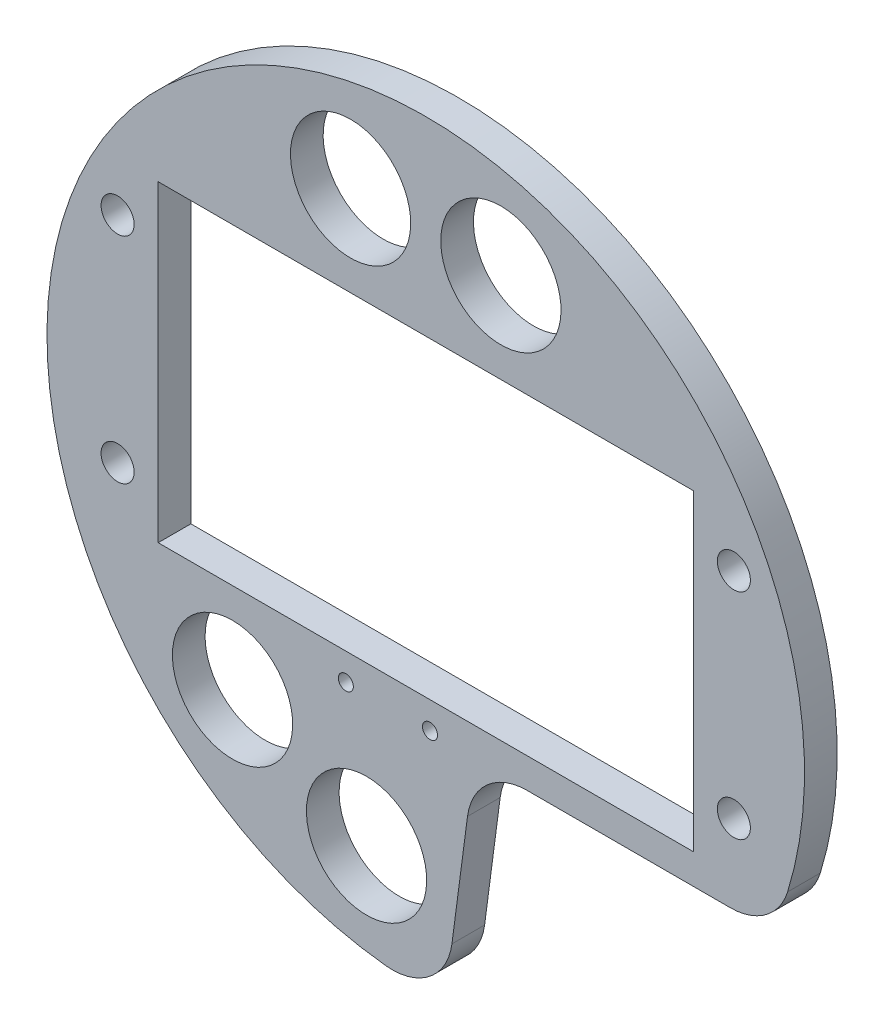
ISO-10303-21;
HEADER;
FILE_DESCRIPTION(('STEP AP214'),'2;1');
FILE_NAME('part.step','',(''),(''),'','','');
FILE_SCHEMA(('AUTOMOTIVE_DESIGN { 1 0 10303 214 1 1 1 1 }'));
ENDSEC;
DATA;
#1=APPLICATION_CONTEXT('core data for automotive mechanical design processes');
#2=APPLICATION_PROTOCOL_DEFINITION('international standard','automotive_design',2000,#1);
#3=PRODUCT_CONTEXT('',#1,'mechanical');
#4=PRODUCT('Part','Part','',(#3));
#5=PRODUCT_RELATED_PRODUCT_CATEGORY('part','',(#4));
#6=PRODUCT_DEFINITION_FORMATION('','',#4);
#7=PRODUCT_DEFINITION_CONTEXT('part definition',#1,'design');
#8=PRODUCT_DEFINITION('design','',#6,#7);
#9=PRODUCT_DEFINITION_SHAPE('','',#8);
#10=(LENGTH_UNIT() NAMED_UNIT(*) SI_UNIT(.MILLI.,.METRE.));
#11=(NAMED_UNIT(*) PLANE_ANGLE_UNIT() SI_UNIT($,.RADIAN.));
#12=(NAMED_UNIT(*) SI_UNIT($,.STERADIAN.) SOLID_ANGLE_UNIT());
#13=UNCERTAINTY_MEASURE_WITH_UNIT(LENGTH_MEASURE(1.E-05),#10,'distance_accuracy_value','');
#14=(GEOMETRIC_REPRESENTATION_CONTEXT(3) GLOBAL_UNCERTAINTY_ASSIGNED_CONTEXT((#13)) GLOBAL_UNIT_ASSIGNED_CONTEXT((#10,
#11,#12)) REPRESENTATION_CONTEXT('',''));
#15=CARTESIAN_POINT('',(0.,0.,0.));
#16=DIRECTION('',(0.,0.,1.));
#17=DIRECTION('',(1.,0.,0.));
#18=AXIS2_PLACEMENT_3D('',#15,#16,#17);
#19=CARTESIAN_POINT('',(50.6348115954456,-15.65617624753,-105.1894));
#20=DIRECTION('',(0.,0.,-1.));
#21=DIRECTION('',(0.,1.,0.));
#22=AXIS2_PLACEMENT_3D('',#19,#20,#21);
#23=CYLINDRICAL_SURFACE('',#22,10.);
#24=CARTESIAN_POINT('',(50.6348115954456,-15.65617624753,-110.625));
#25=DIRECTION('',(0.,0.,-1.));
#26=DIRECTION('',(0.,-1.,0.));
#27=AXIS2_PLACEMENT_3D('',#24,#25,#26);
#28=CIRCLE('',#27,10.);
#29=CARTESIAN_POINT('',(60.1885496323222,-18.6101717659319,-110.625));
#30=VERTEX_POINT('',#29);
#31=CARTESIAN_POINT('',(50.6348115954456,-25.65617624753,-110.625));
#32=VERTEX_POINT('',#31);
#33=EDGE_CURVE('E150',#30,#32,#28,.T.);
#34=ORIENTED_EDGE('',*,*,#33,.F.);
#35=DIRECTION('',(0.,0.,-1.));
#36=VECTOR('',#35,1.);
#37=CARTESIAN_POINT('',(60.1885496323222,-18.6101717659319,-105.1894));
#38=LINE('',#37,#36);
#39=CARTESIAN_POINT('',(60.1885496323222,-18.6101717659319,-105.1894));
#40=VERTEX_POINT('',#39);
#41=EDGE_CURVE('E11',#40,#30,#38,.T.);
#42=ORIENTED_EDGE('',*,*,#41,.F.);
#43=CARTESIAN_POINT('',(50.6348115954456,-15.65617624753,-105.1894));
#44=DIRECTION('',(0.,0.,-1.));
#45=DIRECTION('',(0.,-1.,0.));
#46=AXIS2_PLACEMENT_3D('',#43,#44,#45);
#47=CIRCLE('',#46,10.);
#48=CARTESIAN_POINT('',(50.6348115954456,-25.65617624753,-105.1894));
#49=VERTEX_POINT('',#48);
#50=EDGE_CURVE('E154',#40,#49,#47,.T.);
#51=ORIENTED_EDGE('',*,*,#50,.T.);
#52=DIRECTION('',(0.,0.,-1.));
#53=VECTOR('',#52,1.);
#54=CARTESIAN_POINT('',(50.6348115954456,-25.65617624753,-105.1894));
#55=LINE('',#54,#53);
#56=EDGE_CURVE('E39',#49,#32,#55,.T.);
#57=ORIENTED_EDGE('',*,*,#56,.T.);
#58=EDGE_LOOP('',(#34,#42,#51,#57));
#59=FACE_BOUND('',#58,.T.);
#60=ADVANCED_FACE('F36',(#59),#23,.T.);
#61=CARTESIAN_POINT('',(0.,0.,-105.1894));
#62=DIRECTION('',(0.,0.,-1.));
#63=DIRECTION('',(0.,1.,0.));
#64=AXIS2_PLACEMENT_3D('',#61,#62,#63);
#65=CYLINDRICAL_SURFACE('',#64,63.);
#66=CARTESIAN_POINT('',(0.,0.,-110.625));
#67=DIRECTION('',(0.,0.,-1.));
#68=DIRECTION('',(0.,1.,0.));
#69=AXIS2_PLACEMENT_3D('',#66,#67,#68);
#70=CIRCLE('',#69,63.);
#71=CARTESIAN_POINT('',(-6.60549085481736,-62.6527532560775,-110.625));
#72=VERTEX_POINT('',#71);
#73=EDGE_CURVE('E158',#72,#30,#70,.T.);
#74=ORIENTED_EDGE('',*,*,#73,.F.);
#75=DIRECTION('',(0.,0.,-1.));
#76=VECTOR('',#75,1.);
#77=CARTESIAN_POINT('',(-6.60549085481736,-62.6527532560775,-105.1894));
#78=LINE('',#77,#76);
#79=CARTESIAN_POINT('',(-6.60549085481736,-62.6527532560775,-105.1894));
#80=VERTEX_POINT('',#79);
#81=EDGE_CURVE('E44',#80,#72,#78,.T.);
#82=ORIENTED_EDGE('',*,*,#81,.F.);
#83=CARTESIAN_POINT('',(0.,0.,-105.1894));
#84=DIRECTION('',(0.,0.,-1.));
#85=DIRECTION('',(0.,1.,0.));
#86=AXIS2_PLACEMENT_3D('',#83,#84,#85);
#87=CIRCLE('',#86,63.);
#88=EDGE_CURVE('E170',#80,#40,#87,.T.);
#89=ORIENTED_EDGE('',*,*,#88,.T.);
#90=ORIENTED_EDGE('',*,*,#41,.T.);
#91=EDGE_LOOP('',(#74,#82,#89,#90));
#92=FACE_BOUND('',#91,.T.);
#93=ADVANCED_FACE('F207',(#92),#65,.T.);
#94=CARTESIAN_POINT('',(-5.55700024294159,-52.7078717868588,-105.1894));
#95=DIRECTION('',(0.,0.,-1.));
#96=DIRECTION('',(0.,1.,0.));
#97=AXIS2_PLACEMENT_3D('',#94,#95,#96);
#98=CYLINDRICAL_SURFACE('',#97,9.99999999999999);
#99=CARTESIAN_POINT('',(-5.55700024294159,-52.7078717868588,-110.625));
#100=DIRECTION('',(0.,0.,-1.));
#101=DIRECTION('',(0.,1.,0.));
#102=AXIS2_PLACEMENT_3D('',#99,#100,#101);
#103=CIRCLE('',#102,9.99999999999999);
#104=CARTESIAN_POINT('',(4.35744837079652,-54.0131337090593,-110.625));
#105=VERTEX_POINT('',#104);
#106=EDGE_CURVE('E184',#105,#72,#103,.T.);
#107=ORIENTED_EDGE('',*,*,#106,.F.);
#108=DIRECTION('',(0.,0.,-1.));
#109=VECTOR('',#108,1.);
#110=CARTESIAN_POINT('',(4.35744837079652,-54.0131337090593,-105.1894));
#111=LINE('',#110,#109);
#112=CARTESIAN_POINT('',(4.35744837079652,-54.0131337090593,-105.1894));
#113=VERTEX_POINT('',#112);
#114=EDGE_CURVE('E190',#113,#105,#111,.T.);
#115=ORIENTED_EDGE('',*,*,#114,.F.);
#116=CARTESIAN_POINT('',(-5.55700024294159,-52.7078717868588,-105.1894));
#117=DIRECTION('',(0.,0.,-1.));
#118=DIRECTION('',(0.,1.,0.));
#119=AXIS2_PLACEMENT_3D('',#116,#117,#118);
#120=CIRCLE('',#119,9.99999999999999);
#121=EDGE_CURVE('E167',#113,#80,#120,.T.);
#122=ORIENTED_EDGE('',*,*,#121,.T.);
#123=ORIENTED_EDGE('',*,*,#81,.T.);
#124=EDGE_LOOP('',(#107,#115,#122,#123));
#125=FACE_BOUND('',#124,.T.);
#126=ADVANCED_FACE('F218',(#125),#98,.T.);
#127=CARTESIAN_POINT('',(4.35744837079652,-54.0131337090593,-105.1894));
#128=DIRECTION('',(0.991444861373811,-0.130526192220045,0.));
#129=DIRECTION('',(0.130526192220045,0.991444861373811,0.));
#130=AXIS2_PLACEMENT_3D('',#127,#128,#129);
#131=PLANE('',#130);
#132=DIRECTION('',(-0.130526192220045,-0.991444861373811,0.));
#133=VECTOR('',#132,1.);
#134=CARTESIAN_POINT('',(4.35744837079652,-54.0131337090593,-110.625));
#135=LINE('',#134,#133);
#136=CARTESIAN_POINT('',(6.94602866077572,-34.3509143253296,-110.625));
#137=VERTEX_POINT('',#136);
#138=EDGE_CURVE('E181',#137,#105,#135,.T.);
#139=ORIENTED_EDGE('',*,*,#138,.F.);
#140=DIRECTION('',(0.,0.,-1.));
#141=VECTOR('',#140,1.);
#142=CARTESIAN_POINT('',(6.94602866077572,-34.3509143253296,-105.1894));
#143=LINE('',#142,#141);
#144=CARTESIAN_POINT('',(6.94602866077572,-34.3509143253296,-105.1894));
#145=VERTEX_POINT('',#144);
#146=EDGE_CURVE('E192',#145,#137,#143,.T.);
#147=ORIENTED_EDGE('',*,*,#146,.F.);
#148=DIRECTION('',(-0.130526192220045,-0.991444861373811,0.));
#149=VECTOR('',#148,1.);
#150=CARTESIAN_POINT('',(4.35744837079652,-54.0131337090593,-105.1894));
#151=LINE('',#150,#149);
#152=EDGE_CURVE('E164',#145,#113,#151,.T.);
#153=ORIENTED_EDGE('',*,*,#152,.T.);
#154=ORIENTED_EDGE('',*,*,#114,.T.);
#155=EDGE_LOOP('',(#139,#147,#153,#154));
#156=FACE_BOUND('',#155,.T.);
#157=ADVANCED_FACE('F216',(#156),#131,.T.);
#158=CARTESIAN_POINT('',(16.8604772745138,-35.65617624753,-105.1894));
#159=DIRECTION('',(0.,0.,-1.));
#160=DIRECTION('',(0.,1.,0.));
#161=AXIS2_PLACEMENT_3D('',#158,#159,#160);
#162=CYLINDRICAL_SURFACE('',#161,10.);
#163=CARTESIAN_POINT('',(16.8604772745138,-35.65617624753,-110.625));
#164=DIRECTION('',(0.,0.,1.));
#165=DIRECTION('',(0.,1.,0.));
#166=AXIS2_PLACEMENT_3D('',#163,#164,#165);
#167=CIRCLE('',#166,10.);
#168=CARTESIAN_POINT('',(16.8604772745138,-25.65617624753,-110.625));
#169=VERTEX_POINT('',#168);
#170=EDGE_CURVE('E178',#169,#137,#167,.T.);
#171=ORIENTED_EDGE('',*,*,#170,.F.);
#172=DIRECTION('',(0.,0.,-1.));
#173=VECTOR('',#172,1.);
#174=CARTESIAN_POINT('',(16.8604772745138,-25.65617624753,-105.1894));
#175=LINE('',#174,#173);
#176=CARTESIAN_POINT('',(16.8604772745138,-25.65617624753,-105.1894));
#177=VERTEX_POINT('',#176);
#178=EDGE_CURVE('E193',#177,#169,#175,.T.);
#179=ORIENTED_EDGE('',*,*,#178,.F.);
#180=CARTESIAN_POINT('',(16.8604772745138,-35.65617624753,-105.1894));
#181=DIRECTION('',(0.,0.,1.));
#182=DIRECTION('',(0.,1.,0.));
#183=AXIS2_PLACEMENT_3D('',#180,#181,#182);
#184=CIRCLE('',#183,10.);
#185=EDGE_CURVE('E161',#177,#145,#184,.T.);
#186=ORIENTED_EDGE('',*,*,#185,.T.);
#187=ORIENTED_EDGE('',*,*,#146,.T.);
#188=EDGE_LOOP('',(#171,#179,#186,#187));
#189=FACE_BOUND('',#188,.T.);
#190=ADVANCED_FACE('F213',(#189),#162,.F.);
#191=CARTESIAN_POINT('',(16.8604772745138,-25.65617624753,-105.1894));
#192=DIRECTION('',(0.,-1.,0.));
#193=DIRECTION('',(0.,0.,-1.));
#194=AXIS2_PLACEMENT_3D('',#191,#192,#193);
#195=PLANE('',#194);
#196=DIRECTION('',(-1.,0.,0.));
#197=VECTOR('',#196,1.);
#198=CARTESIAN_POINT('',(16.8604772745138,-25.65617624753,-110.625));
#199=LINE('',#198,#197);
#200=EDGE_CURVE('E175',#32,#169,#199,.T.);
#201=ORIENTED_EDGE('',*,*,#200,.F.);
#202=ORIENTED_EDGE('',*,*,#56,.F.);
#203=DIRECTION('',(-1.,0.,0.));
#204=VECTOR('',#203,1.);
#205=CARTESIAN_POINT('',(16.8604772745138,-25.65617624753,-105.1894));
#206=LINE('',#205,#204);
#207=EDGE_CURVE('E157',#49,#177,#206,.T.);
#208=ORIENTED_EDGE('',*,*,#207,.T.);
#209=ORIENTED_EDGE('',*,*,#178,.T.);
#210=EDGE_LOOP('',(#201,#202,#208,#209));
#211=FACE_BOUND('',#210,.T.);
#212=ADVANCED_FACE('F201',(#211),#195,.T.);
#213=CARTESIAN_POINT('',(50.6348115954456,-15.65617624753,-105.1894));
#214=DIRECTION('',(0.,0.,1.));
#215=DIRECTION('',(0.,-1.,0.));
#216=AXIS2_PLACEMENT_3D('',#213,#214,#215);
#217=PLANE('',#216);
#218=CARTESIAN_POINT('',(0.708583228807126,-25.15617624753,-105.1894));
#219=DIRECTION('',(0.,0.,-1.));
#220=DIRECTION('',(0.,1.,0.));
#221=AXIS2_PLACEMENT_3D('',#218,#219,#220);
#222=CIRCLE('',#221,1.25);
#223=CARTESIAN_POINT('',(0.708583228807126,-23.90617624753,-105.1894));
#224=VERTEX_POINT('',#223);
#225=EDGE_CURVE('E419',#224,#224,#222,.T.);
#226=ORIENTED_EDGE('',*,*,#225,.T.);
#227=EDGE_LOOP('',(#226));
#228=FACE_BOUND('',#227,.T.);
#229=CARTESIAN_POINT('',(-13.2914167711929,-25.15617624753,-105.1894));
#230=DIRECTION('',(0.,0.,-1.));
#231=DIRECTION('',(0.,1.,0.));
#232=AXIS2_PLACEMENT_3D('',#229,#230,#231);
#233=CIRCLE('',#232,1.25);
#234=CARTESIAN_POINT('',(-13.2914167711929,-23.90617624753,-105.1894));
#235=VERTEX_POINT('',#234);
#236=EDGE_CURVE('E427',#235,#235,#233,.T.);
#237=ORIENTED_EDGE('',*,*,#236,.T.);
#238=EDGE_LOOP('',(#237));
#239=FACE_BOUND('',#238,.T.);
#240=CARTESIAN_POINT('',(51.25,23.1840462387393,-105.1894));
#241=DIRECTION('',(0.,0.,-1.));
#242=DIRECTION('',(0.,1.,0.));
#243=AXIS2_PLACEMENT_3D('',#240,#241,#242);
#244=CIRCLE('',#243,2.75);
#245=CARTESIAN_POINT('',(51.25,25.9340462387393,-105.1894));
#246=VERTEX_POINT('',#245);
#247=EDGE_CURVE('E433',#246,#246,#244,.T.);
#248=ORIENTED_EDGE('',*,*,#247,.T.);
#249=EDGE_LOOP('',(#248));
#250=FACE_BOUND('',#249,.T.);
#251=CARTESIAN_POINT('',(51.25,-12.4963987337993,-105.1894));
#252=DIRECTION('',(0.,0.,-1.));
#253=DIRECTION('',(0.,1.,0.));
#254=AXIS2_PLACEMENT_3D('',#251,#252,#253);
#255=CIRCLE('',#254,2.75);
#256=CARTESIAN_POINT('',(51.25,-9.74639873379933,-105.1894));
#257=VERTEX_POINT('',#256);
#258=EDGE_CURVE('E439',#257,#257,#255,.T.);
#259=ORIENTED_EDGE('',*,*,#258,.T.);
#260=EDGE_LOOP('',(#259));
#261=FACE_BOUND('',#260,.T.);
#262=CARTESIAN_POINT('',(-51.25,23.1840462387393,-105.1894));
#263=DIRECTION('',(0.,0.,-1.));
#264=DIRECTION('',(0.,1.,0.));
#265=AXIS2_PLACEMENT_3D('',#262,#263,#264);
#266=CIRCLE('',#265,2.75);
#267=CARTESIAN_POINT('',(-51.25,25.9340462387393,-105.1894));
#268=VERTEX_POINT('',#267);
#269=EDGE_CURVE('E445',#268,#268,#266,.T.);
#270=ORIENTED_EDGE('',*,*,#269,.T.);
#271=EDGE_LOOP('',(#270));
#272=FACE_BOUND('',#271,.T.);
#273=CARTESIAN_POINT('',(-51.25,-12.4963987337993,-105.1894));
#274=DIRECTION('',(0.,0.,-1.));
#275=DIRECTION('',(0.,1.,0.));
#276=AXIS2_PLACEMENT_3D('',#273,#274,#275);
#277=CIRCLE('',#276,2.75);
#278=CARTESIAN_POINT('',(-51.25,-9.74639873379932,-105.1894));
#279=VERTEX_POINT('',#278);
#280=EDGE_CURVE('E451',#279,#279,#277,.T.);
#281=ORIENTED_EDGE('',*,*,#280,.T.);
#282=EDGE_LOOP('',(#281));
#283=FACE_BOUND('',#282,.T.);
#284=CARTESIAN_POINT('',(-9.84596747945683,-46.9793244352607,-105.1894));
#285=DIRECTION('',(0.,0.,-1.));
#286=DIRECTION('',(0.,1.,0.));
#287=AXIS2_PLACEMENT_3D('',#284,#285,#286);
#288=CIRCLE('',#287,10.);
#289=CARTESIAN_POINT('',(-9.84596747945683,-36.9793244352607,-105.1894));
#290=VERTEX_POINT('',#289);
#291=EDGE_CURVE('E457',#290,#290,#288,.T.);
#292=ORIENTED_EDGE('',*,*,#291,.T.);
#293=EDGE_LOOP('',(#292));
#294=FACE_BOUND('',#293,.T.);
#295=CARTESIAN_POINT('',(-32.1346712353663,-35.65617624753,-105.1894));
#296=DIRECTION('',(0.,0.,-1.));
#297=DIRECTION('',(0.,1.,0.));
#298=AXIS2_PLACEMENT_3D('',#295,#296,#297);
#299=CIRCLE('',#298,10.);
#300=CARTESIAN_POINT('',(-32.1346712353663,-25.65617624753,-105.1894));
#301=VERTEX_POINT('',#300);
#302=EDGE_CURVE('E463',#301,#301,#299,.T.);
#303=ORIENTED_EDGE('',*,*,#302,.T.);
#304=EDGE_LOOP('',(#303));
#305=FACE_BOUND('',#304,.T.);
#306=CARTESIAN_POINT('',(12.5,46.34382375247,-105.1894));
#307=DIRECTION('',(0.,0.,-1.));
#308=DIRECTION('',(0.,1.,0.));
#309=AXIS2_PLACEMENT_3D('',#306,#307,#308);
#310=CIRCLE('',#309,10.);
#311=CARTESIAN_POINT('',(12.5,56.34382375247,-105.1894));
#312=VERTEX_POINT('',#311);
#313=EDGE_CURVE('E469',#312,#312,#310,.T.);
#314=ORIENTED_EDGE('',*,*,#313,.T.);
#315=EDGE_LOOP('',(#314));
#316=FACE_BOUND('',#315,.T.);
#317=CARTESIAN_POINT('',(-12.5,46.34382375247,-105.1894));
#318=DIRECTION('',(0.,0.,-1.));
#319=DIRECTION('',(0.,1.,0.));
#320=AXIS2_PLACEMENT_3D('',#317,#318,#319);
#321=CIRCLE('',#320,10.);
#322=CARTESIAN_POINT('',(-12.5,56.34382375247,-105.1894));
#323=VERTEX_POINT('',#322);
#324=EDGE_CURVE('E144',#323,#323,#321,.T.);
#325=ORIENTED_EDGE('',*,*,#324,.T.);
#326=EDGE_LOOP('',(#325));
#327=FACE_BOUND('',#326,.T.);
#328=DIRECTION('',(0.,-1.,0.));
#329=VECTOR('',#328,1.);
#330=CARTESIAN_POINT('',(44.5,-20.65617624753,-105.1894));
#331=LINE('',#330,#329);
#332=CARTESIAN_POINT('',(44.5,31.3438237524699,-105.1894));
#333=VERTEX_POINT('',#332);
#334=CARTESIAN_POINT('',(44.5,-20.65617624753,-105.1894));
#335=VERTEX_POINT('',#334);
#336=EDGE_CURVE('E115',#333,#335,#331,.T.);
#337=ORIENTED_EDGE('',*,*,#336,.T.);
#338=DIRECTION('',(-1.,0.,0.));
#339=VECTOR('',#338,1.);
#340=CARTESIAN_POINT('',(-44.5,-20.65617624753,-105.1894));
#341=LINE('',#340,#339);
#342=CARTESIAN_POINT('',(-44.5,-20.65617624753,-105.1894));
#343=VERTEX_POINT('',#342);
#344=EDGE_CURVE('E124',#335,#343,#341,.T.);
#345=ORIENTED_EDGE('',*,*,#344,.T.);
#346=DIRECTION('',(0.,1.,0.));
#347=VECTOR('',#346,1.);
#348=CARTESIAN_POINT('',(-44.5,-20.65617624753,-105.1894));
#349=LINE('',#348,#347);
#350=CARTESIAN_POINT('',(-44.5,31.34382375247,-105.1894));
#351=VERTEX_POINT('',#350);
#352=EDGE_CURVE('E52',#343,#351,#349,.T.);
#353=ORIENTED_EDGE('',*,*,#352,.T.);
#354=DIRECTION('',(1.,0.,0.));
#355=VECTOR('',#354,1.);
#356=CARTESIAN_POINT('',(-44.5,31.34382375247,-105.1894));
#357=LINE('',#356,#355);
#358=EDGE_CURVE('E121',#351,#333,#357,.T.);
#359=ORIENTED_EDGE('',*,*,#358,.T.);
#360=EDGE_LOOP('',(#337,#345,#353,#359));
#361=FACE_BOUND('',#360,.T.);
#362=ORIENTED_EDGE('',*,*,#50,.F.);
#363=ORIENTED_EDGE('',*,*,#88,.F.);
#364=ORIENTED_EDGE('',*,*,#121,.F.);
#365=ORIENTED_EDGE('',*,*,#152,.F.);
#366=ORIENTED_EDGE('',*,*,#185,.F.);
#367=ORIENTED_EDGE('',*,*,#207,.F.);
#368=EDGE_LOOP('',(#362,#363,#364,#365,#366,#367));
#369=FACE_BOUND('',#368,.T.);
#370=ADVANCED_FACE('F128',(#228,#239,#250,#261,#272,#283,#294,#305,#316,#327,#361,#369),#217,.T.);
#371=CARTESIAN_POINT('',(50.6348115954456,-15.65617624753,-110.625));
#372=DIRECTION('',(0.,0.,1.));
#373=DIRECTION('',(0.,-1.,0.));
#374=AXIS2_PLACEMENT_3D('',#371,#372,#373);
#375=PLANE('',#374);
#376=CARTESIAN_POINT('',(0.708583228807125,-25.15617624753,-110.625));
#377=DIRECTION('',(0.,0.,-1.));
#378=DIRECTION('',(0.,1.,0.));
#379=AXIS2_PLACEMENT_3D('',#376,#377,#378);
#380=CIRCLE('',#379,1.25);
#381=CARTESIAN_POINT('',(0.708583228807125,-23.90617624753,-110.625));
#382=VERTEX_POINT('',#381);
#383=EDGE_CURVE('E422',#382,#382,#380,.T.);
#384=ORIENTED_EDGE('',*,*,#383,.F.);
#385=EDGE_LOOP('',(#384));
#386=FACE_BOUND('',#385,.T.);
#387=CARTESIAN_POINT('',(-13.2914167711929,-25.15617624753,-110.625));
#388=DIRECTION('',(0.,0.,-1.));
#389=DIRECTION('',(0.,1.,0.));
#390=AXIS2_PLACEMENT_3D('',#387,#388,#389);
#391=CIRCLE('',#390,1.25);
#392=CARTESIAN_POINT('',(-13.2914167711929,-23.90617624753,-110.625));
#393=VERTEX_POINT('',#392);
#394=EDGE_CURVE('E424',#393,#393,#391,.T.);
#395=ORIENTED_EDGE('',*,*,#394,.F.);
#396=EDGE_LOOP('',(#395));
#397=FACE_BOUND('',#396,.T.);
#398=CARTESIAN_POINT('',(51.25,23.1840462387393,-110.625));
#399=DIRECTION('',(0.,0.,-1.));
#400=DIRECTION('',(0.,1.,0.));
#401=AXIS2_PLACEMENT_3D('',#398,#399,#400);
#402=CIRCLE('',#401,2.75);
#403=CARTESIAN_POINT('',(51.25,25.9340462387393,-110.625));
#404=VERTEX_POINT('',#403);
#405=EDGE_CURVE('E430',#404,#404,#402,.T.);
#406=ORIENTED_EDGE('',*,*,#405,.F.);
#407=EDGE_LOOP('',(#406));
#408=FACE_BOUND('',#407,.T.);
#409=CARTESIAN_POINT('',(51.25,-12.4963987337993,-110.625));
#410=DIRECTION('',(0.,0.,-1.));
#411=DIRECTION('',(0.,1.,0.));
#412=AXIS2_PLACEMENT_3D('',#409,#410,#411);
#413=CIRCLE('',#412,2.75);
#414=CARTESIAN_POINT('',(51.25,-9.74639873379933,-110.625));
#415=VERTEX_POINT('',#414);
#416=EDGE_CURVE('E436',#415,#415,#413,.T.);
#417=ORIENTED_EDGE('',*,*,#416,.F.);
#418=EDGE_LOOP('',(#417));
#419=FACE_BOUND('',#418,.T.);
#420=CARTESIAN_POINT('',(-51.25,23.1840462387393,-110.625));
#421=DIRECTION('',(0.,0.,-1.));
#422=DIRECTION('',(0.,1.,0.));
#423=AXIS2_PLACEMENT_3D('',#420,#421,#422);
#424=CIRCLE('',#423,2.75);
#425=CARTESIAN_POINT('',(-51.25,25.9340462387393,-110.625));
#426=VERTEX_POINT('',#425);
#427=EDGE_CURVE('E442',#426,#426,#424,.T.);
#428=ORIENTED_EDGE('',*,*,#427,.F.);
#429=EDGE_LOOP('',(#428));
#430=FACE_BOUND('',#429,.T.);
#431=CARTESIAN_POINT('',(-51.25,-12.4963987337993,-110.625));
#432=DIRECTION('',(0.,0.,-1.));
#433=DIRECTION('',(0.,1.,0.));
#434=AXIS2_PLACEMENT_3D('',#431,#432,#433);
#435=CIRCLE('',#434,2.75);
#436=CARTESIAN_POINT('',(-51.25,-9.74639873379932,-110.625));
#437=VERTEX_POINT('',#436);
#438=EDGE_CURVE('E448',#437,#437,#435,.T.);
#439=ORIENTED_EDGE('',*,*,#438,.F.);
#440=EDGE_LOOP('',(#439));
#441=FACE_BOUND('',#440,.T.);
#442=CARTESIAN_POINT('',(-9.84596747945683,-46.9793244352607,-110.625));
#443=DIRECTION('',(0.,0.,-1.));
#444=DIRECTION('',(0.,1.,0.));
#445=AXIS2_PLACEMENT_3D('',#442,#443,#444);
#446=CIRCLE('',#445,10.);
#447=CARTESIAN_POINT('',(-9.84596747945683,-36.9793244352607,-110.625));
#448=VERTEX_POINT('',#447);
#449=EDGE_CURVE('E454',#448,#448,#446,.T.);
#450=ORIENTED_EDGE('',*,*,#449,.F.);
#451=EDGE_LOOP('',(#450));
#452=FACE_BOUND('',#451,.T.);
#453=CARTESIAN_POINT('',(-32.1346712353663,-35.65617624753,-110.625));
#454=DIRECTION('',(0.,0.,-1.));
#455=DIRECTION('',(0.,1.,0.));
#456=AXIS2_PLACEMENT_3D('',#453,#454,#455);
#457=CIRCLE('',#456,10.);
#458=CARTESIAN_POINT('',(-32.1346712353663,-25.65617624753,-110.625));
#459=VERTEX_POINT('',#458);
#460=EDGE_CURVE('E460',#459,#459,#457,.T.);
#461=ORIENTED_EDGE('',*,*,#460,.F.);
#462=EDGE_LOOP('',(#461));
#463=FACE_BOUND('',#462,.T.);
#464=CARTESIAN_POINT('',(12.5,46.34382375247,-110.625));
#465=DIRECTION('',(0.,0.,-1.));
#466=DIRECTION('',(0.,1.,0.));
#467=AXIS2_PLACEMENT_3D('',#464,#465,#466);
#468=CIRCLE('',#467,10.);
#469=CARTESIAN_POINT('',(12.5,56.34382375247,-110.625));
#470=VERTEX_POINT('',#469);
#471=EDGE_CURVE('E466',#470,#470,#468,.T.);
#472=ORIENTED_EDGE('',*,*,#471,.F.);
#473=EDGE_LOOP('',(#472));
#474=FACE_BOUND('',#473,.T.);
#475=CARTESIAN_POINT('',(-12.5,46.34382375247,-110.625));
#476=DIRECTION('',(0.,0.,-1.));
#477=DIRECTION('',(0.,1.,0.));
#478=AXIS2_PLACEMENT_3D('',#475,#476,#477);
#479=CIRCLE('',#478,10.);
#480=CARTESIAN_POINT('',(-12.5,56.34382375247,-110.625));
#481=VERTEX_POINT('',#480);
#482=EDGE_CURVE('E137',#481,#481,#479,.T.);
#483=ORIENTED_EDGE('',*,*,#482,.F.);
#484=EDGE_LOOP('',(#483));
#485=FACE_BOUND('',#484,.T.);
#486=DIRECTION('',(-1.,0.,0.));
#487=VECTOR('',#486,1.);
#488=CARTESIAN_POINT('',(-44.5,-20.65617624753,-110.625));
#489=LINE('',#488,#487);
#490=CARTESIAN_POINT('',(44.5,-20.65617624753,-110.625));
#491=VERTEX_POINT('',#490);
#492=CARTESIAN_POINT('',(-44.5,-20.65617624753,-110.625));
#493=VERTEX_POINT('',#492);
#494=EDGE_CURVE('E143',#491,#493,#489,.T.);
#495=ORIENTED_EDGE('',*,*,#494,.F.);
#496=DIRECTION('',(0.,-1.,0.));
#497=VECTOR('',#496,1.);
#498=CARTESIAN_POINT('',(44.5,-20.65617624753,-110.625));
#499=LINE('',#498,#497);
#500=CARTESIAN_POINT('',(44.5,31.3438237524699,-110.625));
#501=VERTEX_POINT('',#500);
#502=EDGE_CURVE('E60',#501,#491,#499,.T.);
#503=ORIENTED_EDGE('',*,*,#502,.F.);
#504=DIRECTION('',(1.,0.,0.));
#505=VECTOR('',#504,1.);
#506=CARTESIAN_POINT('',(-44.5,31.34382375247,-110.625));
#507=LINE('',#506,#505);
#508=CARTESIAN_POINT('',(-44.5,31.34382375247,-110.625));
#509=VERTEX_POINT('',#508);
#510=EDGE_CURVE('E131',#509,#501,#507,.T.);
#511=ORIENTED_EDGE('',*,*,#510,.F.);
#512=DIRECTION('',(0.,1.,0.));
#513=VECTOR('',#512,1.);
#514=CARTESIAN_POINT('',(-44.5,-20.65617624753,-110.625));
#515=LINE('',#514,#513);
#516=EDGE_CURVE('E134',#493,#509,#515,.T.);
#517=ORIENTED_EDGE('',*,*,#516,.F.);
#518=EDGE_LOOP('',(#495,#503,#511,#517));
#519=FACE_BOUND('',#518,.T.);
#520=ORIENTED_EDGE('',*,*,#33,.T.);
#521=ORIENTED_EDGE('',*,*,#200,.T.);
#522=ORIENTED_EDGE('',*,*,#170,.T.);
#523=ORIENTED_EDGE('',*,*,#138,.T.);
#524=ORIENTED_EDGE('',*,*,#106,.T.);
#525=ORIENTED_EDGE('',*,*,#73,.T.);
#526=EDGE_LOOP('',(#520,#521,#522,#523,#524,#525));
#527=FACE_BOUND('',#526,.T.);
#528=ADVANCED_FACE('F203',(#386,#397,#408,#419,#430,#441,#452,#463,#474,#485,#519,#527),#375,.F.);
#529=CARTESIAN_POINT('',(44.5,-20.65617624753,-105.1894));
#530=DIRECTION('',(1.,0.,0.));
#531=DIRECTION('',(0.,0.,-1.));
#532=AXIS2_PLACEMENT_3D('',#529,#530,#531);
#533=PLANE('',#532);
#534=ORIENTED_EDGE('',*,*,#502,.T.);
#535=DIRECTION('',(0.,0.,-1.));
#536=VECTOR('',#535,1.);
#537=CARTESIAN_POINT('',(44.5,-20.65617624753,-105.1894));
#538=LINE('',#537,#536);
#539=EDGE_CURVE('E111',#335,#491,#538,.T.);
#540=ORIENTED_EDGE('',*,*,#539,.F.);
#541=ORIENTED_EDGE('',*,*,#336,.F.);
#542=DIRECTION('',(0.,0.,-1.));
#543=VECTOR('',#542,1.);
#544=CARTESIAN_POINT('',(44.5,31.3438237524699,-105.1894));
#545=LINE('',#544,#543);
#546=EDGE_CURVE('E148',#333,#501,#545,.T.);
#547=ORIENTED_EDGE('',*,*,#546,.T.);
#548=EDGE_LOOP('',(#534,#540,#541,#547));
#549=FACE_BOUND('',#548,.T.);
#550=ADVANCED_FACE('F113',(#549),#533,.F.);
#551=CARTESIAN_POINT('',(-44.5,31.34382375247,-105.1894));
#552=DIRECTION('',(0.,1.,0.));
#553=DIRECTION('',(0.,0.,1.));
#554=AXIS2_PLACEMENT_3D('',#551,#552,#553);
#555=PLANE('',#554);
#556=ORIENTED_EDGE('',*,*,#510,.T.);
#557=ORIENTED_EDGE('',*,*,#546,.F.);
#558=ORIENTED_EDGE('',*,*,#358,.F.);
#559=DIRECTION('',(0.,0.,-1.));
#560=VECTOR('',#559,1.);
#561=CARTESIAN_POINT('',(-44.5,31.34382375247,-105.1894));
#562=LINE('',#561,#560);
#563=EDGE_CURVE('E151',#351,#509,#562,.T.);
#564=ORIENTED_EDGE('',*,*,#563,.T.);
#565=EDGE_LOOP('',(#556,#557,#558,#564));
#566=FACE_BOUND('',#565,.T.);
#567=ADVANCED_FACE('F286',(#566),#555,.F.);
#568=CARTESIAN_POINT('',(-44.5,-20.65617624753,-105.1894));
#569=DIRECTION('',(-1.,0.,0.));
#570=DIRECTION('',(0.,0.,1.));
#571=AXIS2_PLACEMENT_3D('',#568,#569,#570);
#572=PLANE('',#571);
#573=ORIENTED_EDGE('',*,*,#516,.T.);
#574=ORIENTED_EDGE('',*,*,#563,.F.);
#575=ORIENTED_EDGE('',*,*,#352,.F.);
#576=DIRECTION('',(0.,0.,-1.));
#577=VECTOR('',#576,1.);
#578=CARTESIAN_POINT('',(-44.5,-20.65617624753,-105.1894));
#579=LINE('',#578,#577);
#580=EDGE_CURVE('E120',#343,#493,#579,.T.);
#581=ORIENTED_EDGE('',*,*,#580,.T.);
#582=EDGE_LOOP('',(#573,#574,#575,#581));
#583=FACE_BOUND('',#582,.T.);
#584=ADVANCED_FACE('F295',(#583),#572,.F.);
#585=CARTESIAN_POINT('',(-44.5,-20.65617624753,-105.1894));
#586=DIRECTION('',(0.,-1.,0.));
#587=DIRECTION('',(0.,0.,-1.));
#588=AXIS2_PLACEMENT_3D('',#585,#586,#587);
#589=PLANE('',#588);
#590=ORIENTED_EDGE('',*,*,#494,.T.);
#591=ORIENTED_EDGE('',*,*,#580,.F.);
#592=ORIENTED_EDGE('',*,*,#344,.F.);
#593=ORIENTED_EDGE('',*,*,#539,.T.);
#594=EDGE_LOOP('',(#590,#591,#592,#593));
#595=FACE_BOUND('',#594,.T.);
#596=ADVANCED_FACE('F125',(#595),#589,.F.);
#597=CARTESIAN_POINT('',(-12.5,46.34382375247,-105.1894));
#598=DIRECTION('',(0.,0.,-1.));
#599=DIRECTION('',(0.,1.,0.));
#600=AXIS2_PLACEMENT_3D('',#597,#598,#599);
#601=CYLINDRICAL_SURFACE('',#600,10.);
#602=ORIENTED_EDGE('',*,*,#324,.F.);
#603=EDGE_LOOP('',(#602));
#604=FACE_BOUND('',#603,.T.);
#605=ORIENTED_EDGE('',*,*,#482,.T.);
#606=EDGE_LOOP('',(#605));
#607=FACE_BOUND('',#606,.T.);
#608=ADVANCED_FACE('F313',(#604,#607),#601,.F.);
#609=CARTESIAN_POINT('',(12.5,46.34382375247,-105.1894));
#610=DIRECTION('',(0.,0.,-1.));
#611=DIRECTION('',(0.,1.,0.));
#612=AXIS2_PLACEMENT_3D('',#609,#610,#611);
#613=CYLINDRICAL_SURFACE('',#612,10.);
#614=ORIENTED_EDGE('',*,*,#313,.F.);
#615=EDGE_LOOP('',(#614));
#616=FACE_BOUND('',#615,.T.);
#617=ORIENTED_EDGE('',*,*,#471,.T.);
#618=EDGE_LOOP('',(#617));
#619=FACE_BOUND('',#618,.T.);
#620=ADVANCED_FACE('F322',(#616,#619),#613,.F.);
#621=CARTESIAN_POINT('',(-32.1346712353663,-35.65617624753,-105.1894));
#622=DIRECTION('',(0.,0.,-1.));
#623=DIRECTION('',(0.,1.,0.));
#624=AXIS2_PLACEMENT_3D('',#621,#622,#623);
#625=CYLINDRICAL_SURFACE('',#624,10.);
#626=ORIENTED_EDGE('',*,*,#302,.F.);
#627=EDGE_LOOP('',(#626));
#628=FACE_BOUND('',#627,.T.);
#629=ORIENTED_EDGE('',*,*,#460,.T.);
#630=EDGE_LOOP('',(#629));
#631=FACE_BOUND('',#630,.T.);
#632=ADVANCED_FACE('F332',(#628,#631),#625,.F.);
#633=CARTESIAN_POINT('',(-9.84596747945683,-46.9793244352607,-105.1894));
#634=DIRECTION('',(0.,0.,-1.));
#635=DIRECTION('',(0.,1.,0.));
#636=AXIS2_PLACEMENT_3D('',#633,#634,#635);
#637=CYLINDRICAL_SURFACE('',#636,10.);
#638=ORIENTED_EDGE('',*,*,#291,.F.);
#639=EDGE_LOOP('',(#638));
#640=FACE_BOUND('',#639,.T.);
#641=ORIENTED_EDGE('',*,*,#449,.T.);
#642=EDGE_LOOP('',(#641));
#643=FACE_BOUND('',#642,.T.);
#644=ADVANCED_FACE('F342',(#640,#643),#637,.F.);
#645=CARTESIAN_POINT('',(-51.25,-12.4963987337993,-105.1894));
#646=DIRECTION('',(0.,0.,-1.));
#647=DIRECTION('',(0.,1.,0.));
#648=AXIS2_PLACEMENT_3D('',#645,#646,#647);
#649=CYLINDRICAL_SURFACE('',#648,2.75);
#650=ORIENTED_EDGE('',*,*,#280,.F.);
#651=EDGE_LOOP('',(#650));
#652=FACE_BOUND('',#651,.T.);
#653=ORIENTED_EDGE('',*,*,#438,.T.);
#654=EDGE_LOOP('',(#653));
#655=FACE_BOUND('',#654,.T.);
#656=ADVANCED_FACE('F352',(#652,#655),#649,.F.);
#657=CARTESIAN_POINT('',(-51.25,23.1840462387393,-105.1894));
#658=DIRECTION('',(0.,0.,-1.));
#659=DIRECTION('',(0.,1.,0.));
#660=AXIS2_PLACEMENT_3D('',#657,#658,#659);
#661=CYLINDRICAL_SURFACE('',#660,2.75);
#662=ORIENTED_EDGE('',*,*,#269,.F.);
#663=EDGE_LOOP('',(#662));
#664=FACE_BOUND('',#663,.T.);
#665=ORIENTED_EDGE('',*,*,#427,.T.);
#666=EDGE_LOOP('',(#665));
#667=FACE_BOUND('',#666,.T.);
#668=ADVANCED_FACE('F362',(#664,#667),#661,.F.);
#669=CARTESIAN_POINT('',(51.25,-12.4963987337993,-105.1894));
#670=DIRECTION('',(0.,0.,-1.));
#671=DIRECTION('',(0.,1.,0.));
#672=AXIS2_PLACEMENT_3D('',#669,#670,#671);
#673=CYLINDRICAL_SURFACE('',#672,2.75);
#674=ORIENTED_EDGE('',*,*,#258,.F.);
#675=EDGE_LOOP('',(#674));
#676=FACE_BOUND('',#675,.T.);
#677=ORIENTED_EDGE('',*,*,#416,.T.);
#678=EDGE_LOOP('',(#677));
#679=FACE_BOUND('',#678,.T.);
#680=ADVANCED_FACE('F372',(#676,#679),#673,.F.);
#681=CARTESIAN_POINT('',(51.25,23.1840462387393,-105.1894));
#682=DIRECTION('',(0.,0.,-1.));
#683=DIRECTION('',(0.,1.,0.));
#684=AXIS2_PLACEMENT_3D('',#681,#682,#683);
#685=CYLINDRICAL_SURFACE('',#684,2.75);
#686=ORIENTED_EDGE('',*,*,#247,.F.);
#687=EDGE_LOOP('',(#686));
#688=FACE_BOUND('',#687,.T.);
#689=ORIENTED_EDGE('',*,*,#405,.T.);
#690=EDGE_LOOP('',(#689));
#691=FACE_BOUND('',#690,.T.);
#692=ADVANCED_FACE('F382',(#688,#691),#685,.F.);
#693=CARTESIAN_POINT('',(-13.2914167711929,-25.15617624753,-105.1894));
#694=DIRECTION('',(0.,0.,-1.));
#695=DIRECTION('',(0.,1.,0.));
#696=AXIS2_PLACEMENT_3D('',#693,#694,#695);
#697=CYLINDRICAL_SURFACE('',#696,1.25);
#698=ORIENTED_EDGE('',*,*,#236,.F.);
#699=EDGE_LOOP('',(#698));
#700=FACE_BOUND('',#699,.T.);
#701=ORIENTED_EDGE('',*,*,#394,.T.);
#702=EDGE_LOOP('',(#701));
#703=FACE_BOUND('',#702,.T.);
#704=ADVANCED_FACE('F392',(#700,#703),#697,.F.);
#705=CARTESIAN_POINT('',(0.708583228807126,-25.15617624753,-105.1894));
#706=DIRECTION('',(0.,0.,-1.));
#707=DIRECTION('',(0.,1.,0.));
#708=AXIS2_PLACEMENT_3D('',#705,#706,#707);
#709=CYLINDRICAL_SURFACE('',#708,1.25);
#710=ORIENTED_EDGE('',*,*,#225,.F.);
#711=EDGE_LOOP('',(#710));
#712=FACE_BOUND('',#711,.T.);
#713=ORIENTED_EDGE('',*,*,#383,.T.);
#714=EDGE_LOOP('',(#713));
#715=FACE_BOUND('',#714,.T.);
#716=ADVANCED_FACE('F402',(#712,#715),#709,.F.);
#717=CLOSED_SHELL('',(#60,#93,#126,#157,#190,#212,#370,#528,#550,#567,#584,#596,#608,#620,#632,
#644,#656,#668,#680,#692,#704,#716));
#718=MANIFOLD_SOLID_BREP('B2',#717);
#719=ADVANCED_BREP_SHAPE_REPRESENTATION('',(#18,#718),#14);
#720=SHAPE_DEFINITION_REPRESENTATION(#9,#719);
ENDSEC;
END-ISO-10303-21;
